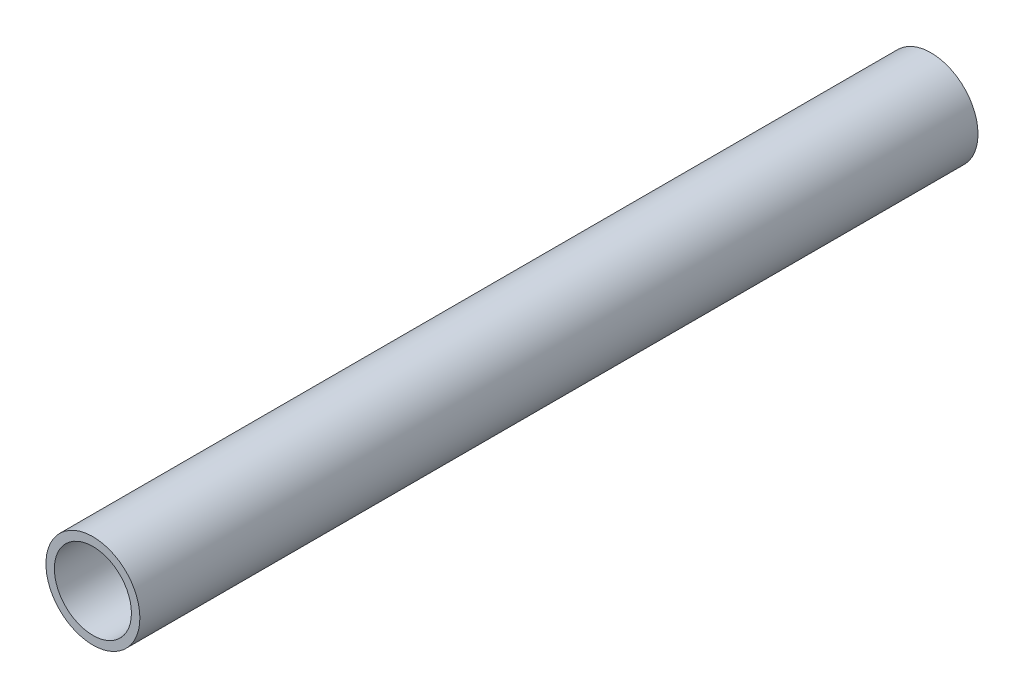
ISO-10303-21;
HEADER;
FILE_DESCRIPTION(('STEP AP214'),'2;1');
FILE_NAME('part.step','',(''),(''),'','','');
FILE_SCHEMA(('AUTOMOTIVE_DESIGN { 1 0 10303 214 1 1 1 1 }'));
ENDSEC;
DATA;
#1=APPLICATION_CONTEXT('core data for automotive mechanical design processes');
#2=APPLICATION_PROTOCOL_DEFINITION('international standard','automotive_design',2000,#1);
#3=PRODUCT_CONTEXT('',#1,'mechanical');
#4=PRODUCT('Part','Part','',(#3));
#5=PRODUCT_RELATED_PRODUCT_CATEGORY('part','',(#4));
#6=PRODUCT_DEFINITION_FORMATION('','',#4);
#7=PRODUCT_DEFINITION_CONTEXT('part definition',#1,'design');
#8=PRODUCT_DEFINITION('design','',#6,#7);
#9=PRODUCT_DEFINITION_SHAPE('','',#8);
#10=(LENGTH_UNIT() NAMED_UNIT(*) SI_UNIT(.MILLI.,.METRE.));
#11=(NAMED_UNIT(*) PLANE_ANGLE_UNIT() SI_UNIT($,.RADIAN.));
#12=(NAMED_UNIT(*) SI_UNIT($,.STERADIAN.) SOLID_ANGLE_UNIT());
#13=UNCERTAINTY_MEASURE_WITH_UNIT(LENGTH_MEASURE(1.E-05),#10,'distance_accuracy_value','');
#14=(GEOMETRIC_REPRESENTATION_CONTEXT(3) GLOBAL_UNCERTAINTY_ASSIGNED_CONTEXT((#13)) GLOBAL_UNIT_ASSIGNED_CONTEXT((#10,
#11,#12)) REPRESENTATION_CONTEXT('',''));
#15=CARTESIAN_POINT('',(0.,0.,0.));
#16=DIRECTION('',(0.,0.,1.));
#17=DIRECTION('',(1.,0.,0.));
#18=AXIS2_PLACEMENT_3D('',#15,#16,#17);
#19=CARTESIAN_POINT('',(0.,0.,44.6));
#20=DIRECTION('',(0.,0.,1.));
#21=DIRECTION('',(1.,0.,0.));
#22=AXIS2_PLACEMENT_3D('',#19,#20,#21);
#23=PLANE('',#22);
#24=CARTESIAN_POINT('',(0.,0.,44.6));
#25=DIRECTION('',(0.,0.,1.));
#26=DIRECTION('',(1.,0.,0.));
#27=AXIS2_PLACEMENT_3D('',#24,#25,#26);
#28=CIRCLE('',#27,5.);
#29=CARTESIAN_POINT('',(5.,0.,44.6));
#30=VERTEX_POINT('',#29);
#31=EDGE_CURVE('E10',#30,#30,#28,.T.);
#32=ORIENTED_EDGE('',*,*,#31,.T.);
#33=EDGE_LOOP('',(#32));
#34=FACE_BOUND('',#33,.T.);
#35=CARTESIAN_POINT('',(0.,0.,44.6));
#36=DIRECTION('',(0.,0.,1.));
#37=DIRECTION('',(1.,0.,0.));
#38=AXIS2_PLACEMENT_3D('',#35,#36,#37);
#39=CIRCLE('',#38,4.1);
#40=CARTESIAN_POINT('',(4.1,0.,44.6));
#41=VERTEX_POINT('',#40);
#42=EDGE_CURVE('E42',#41,#41,#39,.T.);
#43=ORIENTED_EDGE('',*,*,#42,.F.);
#44=EDGE_LOOP('',(#43));
#45=FACE_BOUND('',#44,.T.);
#46=ADVANCED_FACE('F31',(#34,#45),#23,.T.);
#47=CARTESIAN_POINT('',(0.,0.,-44.6));
#48=DIRECTION('',(0.,0.,1.));
#49=DIRECTION('',(1.,0.,0.));
#50=AXIS2_PLACEMENT_3D('',#47,#48,#49);
#51=PLANE('',#50);
#52=CARTESIAN_POINT('',(0.,0.,-44.6));
#53=DIRECTION('',(0.,0.,1.));
#54=DIRECTION('',(1.,0.,0.));
#55=AXIS2_PLACEMENT_3D('',#52,#53,#54);
#56=CIRCLE('',#55,5.);
#57=CARTESIAN_POINT('',(5.,0.,-44.6));
#58=VERTEX_POINT('',#57);
#59=EDGE_CURVE('E35',#58,#58,#56,.T.);
#60=ORIENTED_EDGE('',*,*,#59,.F.);
#61=EDGE_LOOP('',(#60));
#62=FACE_BOUND('',#61,.T.);
#63=CARTESIAN_POINT('',(0.,0.,-44.6));
#64=DIRECTION('',(0.,0.,1.));
#65=DIRECTION('',(1.,0.,0.));
#66=AXIS2_PLACEMENT_3D('',#63,#64,#65);
#67=CIRCLE('',#66,4.1);
#68=CARTESIAN_POINT('',(4.1,0.,-44.6));
#69=VERTEX_POINT('',#68);
#70=EDGE_CURVE('E44',#69,#69,#67,.T.);
#71=ORIENTED_EDGE('',*,*,#70,.T.);
#72=EDGE_LOOP('',(#71));
#73=FACE_BOUND('',#72,.T.);
#74=ADVANCED_FACE('F54',(#62,#73),#51,.F.);
#75=CARTESIAN_POINT('',(0.,0.,44.6));
#76=DIRECTION('',(0.,0.,-1.));
#77=DIRECTION('',(-1.,0.,0.));
#78=AXIS2_PLACEMENT_3D('',#75,#76,#77);
#79=CYLINDRICAL_SURFACE('',#78,5.);
#80=ORIENTED_EDGE('',*,*,#31,.F.);
#81=EDGE_LOOP('',(#80));
#82=FACE_BOUND('',#81,.T.);
#83=ORIENTED_EDGE('',*,*,#59,.T.);
#84=EDGE_LOOP('',(#83));
#85=FACE_BOUND('',#84,.T.);
#86=ADVANCED_FACE('F33',(#82,#85),#79,.T.);
#87=CARTESIAN_POINT('',(0.,0.,44.6));
#88=DIRECTION('',(0.,0.,-1.));
#89=DIRECTION('',(-1.,0.,0.));
#90=AXIS2_PLACEMENT_3D('',#87,#88,#89);
#91=CYLINDRICAL_SURFACE('',#90,4.1);
#92=ORIENTED_EDGE('',*,*,#42,.T.);
#93=EDGE_LOOP('',(#92));
#94=FACE_BOUND('',#93,.T.);
#95=ORIENTED_EDGE('',*,*,#70,.F.);
#96=EDGE_LOOP('',(#95));
#97=FACE_BOUND('',#96,.T.);
#98=ADVANCED_FACE('F50',(#94,#97),#91,.F.);
#99=CLOSED_SHELL('',(#46,#74,#86,#98));
#100=MANIFOLD_SOLID_BREP('B2',#99);
#101=ADVANCED_BREP_SHAPE_REPRESENTATION('',(#18,#100),#14);
#102=SHAPE_DEFINITION_REPRESENTATION(#9,#101);
ENDSEC;
END-ISO-10303-21;
